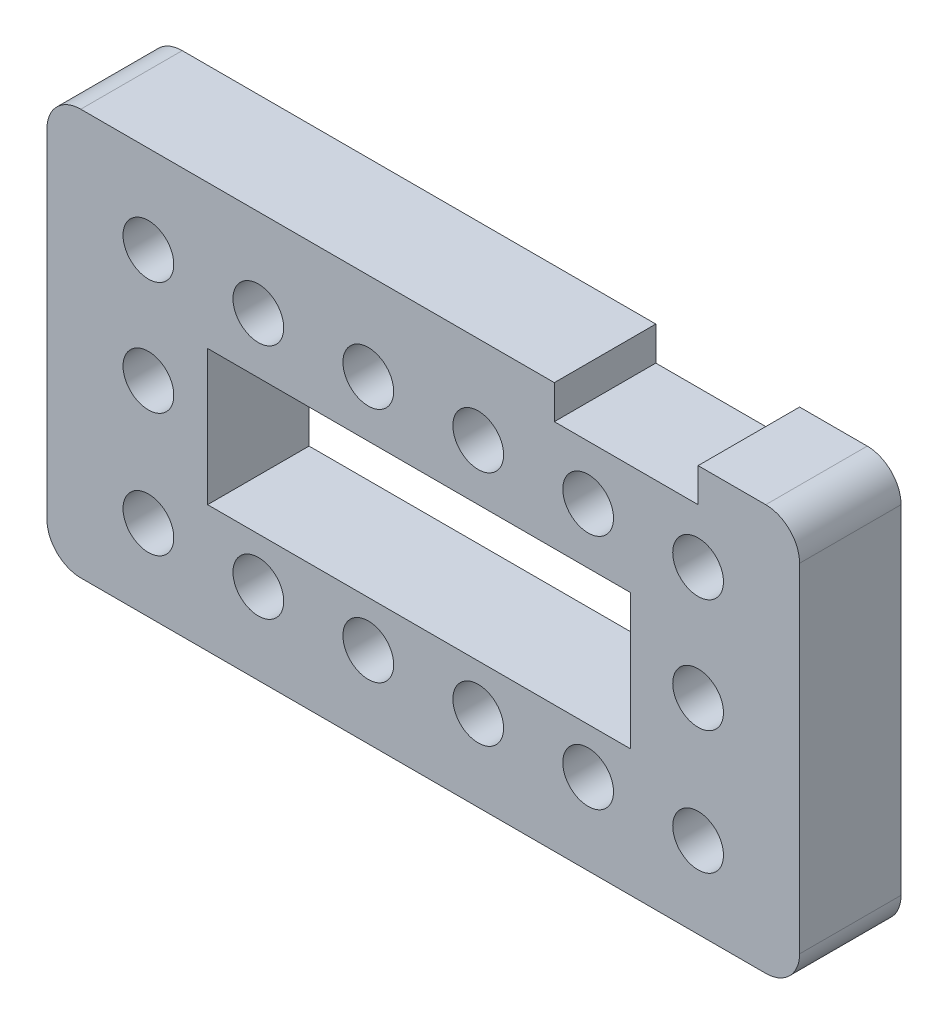
ISO-10303-21;
HEADER;
FILE_DESCRIPTION(('STEP AP214'),'2;1');
FILE_NAME('part.step','',(''),(''),'','','');
FILE_SCHEMA(('AUTOMOTIVE_DESIGN { 1 0 10303 214 1 1 1 1 }'));
ENDSEC;
DATA;
#1=APPLICATION_CONTEXT('core data for automotive mechanical design processes');
#2=APPLICATION_PROTOCOL_DEFINITION('international standard','automotive_design',2000,#1);
#3=PRODUCT_CONTEXT('',#1,'mechanical');
#4=PRODUCT('Part','Part','',(#3));
#5=PRODUCT_RELATED_PRODUCT_CATEGORY('part','',(#4));
#6=PRODUCT_DEFINITION_FORMATION('','',#4);
#7=PRODUCT_DEFINITION_CONTEXT('part definition',#1,'design');
#8=PRODUCT_DEFINITION('design','',#6,#7);
#9=PRODUCT_DEFINITION_SHAPE('','',#8);
#10=(LENGTH_UNIT() NAMED_UNIT(*) SI_UNIT(.MILLI.,.METRE.));
#11=(NAMED_UNIT(*) PLANE_ANGLE_UNIT() SI_UNIT($,.RADIAN.));
#12=(NAMED_UNIT(*) SI_UNIT($,.STERADIAN.) SOLID_ANGLE_UNIT());
#13=UNCERTAINTY_MEASURE_WITH_UNIT(LENGTH_MEASURE(1.E-05),#10,'distance_accuracy_value','');
#14=(GEOMETRIC_REPRESENTATION_CONTEXT(3) GLOBAL_UNCERTAINTY_ASSIGNED_CONTEXT((#13)) GLOBAL_UNIT_ASSIGNED_CONTEXT((#10,
#11,#12)) REPRESENTATION_CONTEXT('',''));
#15=CARTESIAN_POINT('',(0.,0.,0.));
#16=DIRECTION('',(0.,0.,1.));
#17=DIRECTION('',(1.,0.,0.));
#18=AXIS2_PLACEMENT_3D('',#15,#16,#17);
#19=CARTESIAN_POINT('',(-2.,22.,6.));
#20=DIRECTION('',(0.,1.,0.));
#21=DIRECTION('',(0.,0.,-1.));
#22=AXIS2_PLACEMENT_3D('',#19,#20,#21);
#23=PLANE('',#22);
#24=DIRECTION('',(1.,0.,0.));
#25=VECTOR('',#24,1.);
#26=CARTESIAN_POINT('',(-2.,22.,6.));
#27=LINE('',#26,#25);
#28=CARTESIAN_POINT('',(36.5,22.,6.));
#29=VERTEX_POINT('',#28);
#30=CARTESIAN_POINT('',(40.5,22.,6.));
#31=VERTEX_POINT('',#30);
#32=EDGE_CURVE('E159',#29,#31,#27,.T.);
#33=ORIENTED_EDGE('',*,*,#32,.F.);
#34=DIRECTION('',(0.,0.,1.));
#35=VECTOR('',#34,1.);
#36=CARTESIAN_POINT('',(36.5,22.,-26.5));
#37=LINE('',#36,#35);
#38=CARTESIAN_POINT('',(36.5,22.,12.));
#39=VERTEX_POINT('',#38);
#40=EDGE_CURVE('E151',#29,#39,#37,.T.);
#41=ORIENTED_EDGE('',*,*,#40,.T.);
#42=DIRECTION('',(1.,0.,0.));
#43=VECTOR('',#42,1.);
#44=CARTESIAN_POINT('',(-2.,22.,12.));
#45=LINE('',#44,#43);
#46=CARTESIAN_POINT('',(40.5,22.,12.));
#47=VERTEX_POINT('',#46);
#48=EDGE_CURVE('E184',#39,#47,#45,.T.);
#49=ORIENTED_EDGE('',*,*,#48,.T.);
#50=DIRECTION('',(0.,0.,1.));
#51=VECTOR('',#50,1.);
#52=CARTESIAN_POINT('',(40.5,22.,6.));
#53=LINE('',#52,#51);
#54=EDGE_CURVE('E217',#47,#31,#53,.F.);
#55=ORIENTED_EDGE('',*,*,#54,.T.);
#56=EDGE_LOOP('',(#33,#41,#49,#55));
#57=FACE_BOUND('',#56,.T.);
#58=ADVANCED_FACE('F17',(#57),#23,.T.);
#59=CARTESIAN_POINT('',(0.,0.,12.));
#60=DIRECTION('',(0.,0.,1.));
#61=DIRECTION('',(-1.,0.,0.));
#62=AXIS2_PLACEMENT_3D('',#59,#60,#61);
#63=PLANE('',#62);
#64=DIRECTION('',(0.,1.,0.));
#65=VECTOR('',#64,1.);
#66=CARTESIAN_POINT('',(36.5,0.,12.));
#67=LINE('',#66,#65);
#68=CARTESIAN_POINT('',(36.5,20.,12.));
#69=VERTEX_POINT('',#68);
#70=EDGE_CURVE('E280',#69,#39,#67,.T.);
#71=ORIENTED_EDGE('',*,*,#70,.F.);
#72=DIRECTION('',(1.,0.,0.));
#73=VECTOR('',#72,1.);
#74=CARTESIAN_POINT('',(0.,20.,12.));
#75=LINE('',#74,#73);
#76=CARTESIAN_POINT('',(28.,20.,12.));
#77=VERTEX_POINT('',#76);
#78=EDGE_CURVE('E271',#77,#69,#75,.T.);
#79=ORIENTED_EDGE('',*,*,#78,.F.);
#80=DIRECTION('',(0.,-1.,0.));
#81=VECTOR('',#80,1.);
#82=CARTESIAN_POINT('',(28.,0.,12.));
#83=LINE('',#82,#81);
#84=CARTESIAN_POINT('',(28.,22.,12.));
#85=VERTEX_POINT('',#84);
#86=EDGE_CURVE('E275',#85,#77,#83,.T.);
#87=ORIENTED_EDGE('',*,*,#86,.F.);
#88=CARTESIAN_POINT('',(0.,22.,12.));
#89=VERTEX_POINT('',#88);
#90=EDGE_CURVE('E149',#89,#85,#45,.T.);
#91=ORIENTED_EDGE('',*,*,#90,.F.);
#92=CARTESIAN_POINT('',(0.,20.,12.));
#93=DIRECTION('',(0.,0.,1.));
#94=DIRECTION('',(1.,0.,0.));
#95=AXIS2_PLACEMENT_3D('',#92,#93,#94);
#96=CIRCLE('',#95,2.);
#97=CARTESIAN_POINT('',(-2.,20.,12.));
#98=VERTEX_POINT('',#97);
#99=EDGE_CURVE('E201',#89,#98,#96,.T.);
#100=ORIENTED_EDGE('',*,*,#99,.T.);
#101=DIRECTION('',(0.,1.,0.));
#102=VECTOR('',#101,1.);
#103=CARTESIAN_POINT('',(-2.,-2.,12.));
#104=LINE('',#103,#102);
#105=CARTESIAN_POINT('',(-2.,0.,12.));
#106=VERTEX_POINT('',#105);
#107=EDGE_CURVE('E170',#106,#98,#104,.T.);
#108=ORIENTED_EDGE('',*,*,#107,.F.);
#109=CARTESIAN_POINT('',(0.,0.,12.));
#110=DIRECTION('',(0.,0.,1.));
#111=DIRECTION('',(1.,0.,0.));
#112=AXIS2_PLACEMENT_3D('',#109,#110,#111);
#113=CIRCLE('',#112,2.);
#114=CARTESIAN_POINT('',(0.,-2.,12.));
#115=VERTEX_POINT('',#114);
#116=EDGE_CURVE('E204',#106,#115,#113,.T.);
#117=ORIENTED_EDGE('',*,*,#116,.T.);
#118=DIRECTION('',(-1.,0.,0.));
#119=VECTOR('',#118,1.);
#120=CARTESIAN_POINT('',(42.5,-2.,12.));
#121=LINE('',#120,#119);
#122=CARTESIAN_POINT('',(40.5,-2.,12.));
#123=VERTEX_POINT('',#122);
#124=EDGE_CURVE('E188',#123,#115,#121,.T.);
#125=ORIENTED_EDGE('',*,*,#124,.F.);
#126=CARTESIAN_POINT('',(40.5,0.,12.));
#127=DIRECTION('',(0.,0.,1.));
#128=DIRECTION('',(1.,0.,0.));
#129=AXIS2_PLACEMENT_3D('',#126,#127,#128);
#130=CIRCLE('',#129,2.);
#131=CARTESIAN_POINT('',(42.5,0.,12.));
#132=VERTEX_POINT('',#131);
#133=EDGE_CURVE('E207',#123,#132,#130,.T.);
#134=ORIENTED_EDGE('',*,*,#133,.T.);
#135=DIRECTION('',(0.,-1.,0.));
#136=VECTOR('',#135,1.);
#137=CARTESIAN_POINT('',(42.5,22.,12.));
#138=LINE('',#137,#136);
#139=CARTESIAN_POINT('',(42.5,20.,12.));
#140=VERTEX_POINT('',#139);
#141=EDGE_CURVE('E183',#140,#132,#138,.T.);
#142=ORIENTED_EDGE('',*,*,#141,.F.);
#143=CARTESIAN_POINT('',(40.5,20.,12.));
#144=DIRECTION('',(0.,0.,1.));
#145=DIRECTION('',(1.,0.,0.));
#146=AXIS2_PLACEMENT_3D('',#143,#144,#145);
#147=CIRCLE('',#146,2.);
#148=EDGE_CURVE('E210',#140,#47,#147,.T.);
#149=ORIENTED_EDGE('',*,*,#148,.T.);
#150=ORIENTED_EDGE('',*,*,#48,.F.);
#151=EDGE_LOOP('',(#71,#79,#87,#91,#100,#108,#117,#125,#134,#142,#149,#150));
#152=FACE_BOUND('',#151,.T.);
#153=CARTESIAN_POINT('',(10.5,16.8007845059996,12.));
#154=DIRECTION('',(0.,0.,-1.));
#155=DIRECTION('',(-1.,0.,0.));
#156=AXIS2_PLACEMENT_3D('',#153,#154,#155);
#157=CIRCLE('',#156,1.5);
#158=CARTESIAN_POINT('',(9.,16.8007845059996,12.));
#159=VERTEX_POINT('',#158);
#160=EDGE_CURVE('E299',#159,#159,#157,.T.);
#161=ORIENTED_EDGE('',*,*,#160,.T.);
#162=EDGE_LOOP('',(#161));
#163=FACE_BOUND('',#162,.T.);
#164=CARTESIAN_POINT('',(36.5,16.8007845059996,12.));
#165=DIRECTION('',(0.,0.,-1.));
#166=DIRECTION('',(-1.,0.,0.));
#167=AXIS2_PLACEMENT_3D('',#164,#165,#166);
#168=CIRCLE('',#167,1.5);
#169=CARTESIAN_POINT('',(35.,16.8007845059996,12.));
#170=VERTEX_POINT('',#169);
#171=EDGE_CURVE('E315',#170,#170,#168,.T.);
#172=ORIENTED_EDGE('',*,*,#171,.T.);
#173=EDGE_LOOP('',(#172));
#174=FACE_BOUND('',#173,.T.);
#175=CARTESIAN_POINT('',(30.,2.80078450599959,12.));
#176=DIRECTION('',(0.,0.,-1.));
#177=DIRECTION('',(-1.,0.,0.));
#178=AXIS2_PLACEMENT_3D('',#175,#176,#177);
#179=CIRCLE('',#178,1.5);
#180=CARTESIAN_POINT('',(28.5,2.80078450599959,12.));
#181=VERTEX_POINT('',#180);
#182=EDGE_CURVE('E331',#181,#181,#179,.T.);
#183=ORIENTED_EDGE('',*,*,#182,.T.);
#184=EDGE_LOOP('',(#183));
#185=FACE_BOUND('',#184,.T.);
#186=CARTESIAN_POINT('',(4.,10.1007845059996,12.));
#187=DIRECTION('',(0.,0.,-1.));
#188=DIRECTION('',(-1.,0.,0.));
#189=AXIS2_PLACEMENT_3D('',#186,#187,#188);
#190=CIRCLE('',#189,1.5);
#191=CARTESIAN_POINT('',(2.5,10.1007845059996,12.));
#192=VERTEX_POINT('',#191);
#193=EDGE_CURVE('E347',#192,#192,#190,.T.);
#194=ORIENTED_EDGE('',*,*,#193,.T.);
#195=EDGE_LOOP('',(#194));
#196=FACE_BOUND('',#195,.T.);
#197=CARTESIAN_POINT('',(17.,16.8007845059996,12.));
#198=DIRECTION('',(0.,0.,-1.));
#199=DIRECTION('',(-1.,0.,0.));
#200=AXIS2_PLACEMENT_3D('',#197,#198,#199);
#201=CIRCLE('',#200,1.5);
#202=CARTESIAN_POINT('',(15.5,16.8007845059996,12.));
#203=VERTEX_POINT('',#202);
#204=EDGE_CURVE('E363',#203,#203,#201,.T.);
#205=ORIENTED_EDGE('',*,*,#204,.T.);
#206=EDGE_LOOP('',(#205));
#207=FACE_BOUND('',#206,.T.);
#208=CARTESIAN_POINT('',(36.5,2.80078450599959,12.));
#209=DIRECTION('',(0.,0.,-1.));
#210=DIRECTION('',(-1.,0.,0.));
#211=AXIS2_PLACEMENT_3D('',#208,#209,#210);
#212=CIRCLE('',#211,1.5);
#213=CARTESIAN_POINT('',(35.,2.80078450599959,12.));
#214=VERTEX_POINT('',#213);
#215=EDGE_CURVE('E379',#214,#214,#212,.T.);
#216=ORIENTED_EDGE('',*,*,#215,.T.);
#217=EDGE_LOOP('',(#216));
#218=FACE_BOUND('',#217,.T.);
#219=CARTESIAN_POINT('',(10.5,2.80078450599959,12.));
#220=DIRECTION('',(0.,0.,-1.));
#221=DIRECTION('',(-1.,0.,0.));
#222=AXIS2_PLACEMENT_3D('',#219,#220,#221);
#223=CIRCLE('',#222,1.5);
#224=CARTESIAN_POINT('',(9.,2.80078450599959,12.));
#225=VERTEX_POINT('',#224);
#226=EDGE_CURVE('E395',#225,#225,#223,.T.);
#227=ORIENTED_EDGE('',*,*,#226,.T.);
#228=EDGE_LOOP('',(#227));
#229=FACE_BOUND('',#228,.T.);
#230=DIRECTION('',(-1.,0.,0.));
#231=VECTOR('',#230,1.);
#232=CARTESIAN_POINT('',(32.5,5.5,12.));
#233=LINE('',#232,#231);
#234=CARTESIAN_POINT('',(32.5,5.5,12.));
#235=VERTEX_POINT('',#234);
#236=CARTESIAN_POINT('',(7.5,5.5,12.));
#237=VERTEX_POINT('',#236);
#238=EDGE_CURVE('E412',#235,#237,#233,.T.);
#239=ORIENTED_EDGE('',*,*,#238,.T.);
#240=DIRECTION('',(0.,1.,0.));
#241=VECTOR('',#240,1.);
#242=CARTESIAN_POINT('',(7.5,5.5,12.));
#243=LINE('',#242,#241);
#244=CARTESIAN_POINT('',(7.5,13.5,12.));
#245=VERTEX_POINT('',#244);
#246=EDGE_CURVE('E399',#237,#245,#243,.T.);
#247=ORIENTED_EDGE('',*,*,#246,.T.);
#248=DIRECTION('',(1.,0.,0.));
#249=VECTOR('',#248,1.);
#250=CARTESIAN_POINT('',(7.5,13.5,12.));
#251=LINE('',#250,#249);
#252=CARTESIAN_POINT('',(32.5,13.5,12.));
#253=VERTEX_POINT('',#252);
#254=EDGE_CURVE('E406',#245,#253,#251,.T.);
#255=ORIENTED_EDGE('',*,*,#254,.T.);
#256=DIRECTION('',(0.,-1.,0.));
#257=VECTOR('',#256,1.);
#258=CARTESIAN_POINT('',(32.5,13.5,12.));
#259=LINE('',#258,#257);
#260=EDGE_CURVE('E41',#253,#235,#259,.T.);
#261=ORIENTED_EDGE('',*,*,#260,.T.);
#262=EDGE_LOOP('',(#239,#247,#255,#261));
#263=FACE_BOUND('',#262,.T.);
#264=CARTESIAN_POINT('',(23.5,2.80078450599959,12.));
#265=DIRECTION('',(0.,0.,-1.));
#266=DIRECTION('',(-1.,0.,0.));
#267=AXIS2_PLACEMENT_3D('',#264,#265,#266);
#268=CIRCLE('',#267,1.5);
#269=CARTESIAN_POINT('',(22.,2.80078450599959,12.));
#270=VERTEX_POINT('',#269);
#271=EDGE_CURVE('E387',#270,#270,#268,.T.);
#272=ORIENTED_EDGE('',*,*,#271,.T.);
#273=EDGE_LOOP('',(#272));
#274=FACE_BOUND('',#273,.T.);
#275=CARTESIAN_POINT('',(30.,16.8007845059996,12.));
#276=DIRECTION('',(0.,0.,-1.));
#277=DIRECTION('',(-1.,0.,0.));
#278=AXIS2_PLACEMENT_3D('',#275,#276,#277);
#279=CIRCLE('',#278,1.5);
#280=CARTESIAN_POINT('',(28.5,16.8007845059996,12.));
#281=VERTEX_POINT('',#280);
#282=EDGE_CURVE('E371',#281,#281,#279,.T.);
#283=ORIENTED_EDGE('',*,*,#282,.T.);
#284=EDGE_LOOP('',(#283));
#285=FACE_BOUND('',#284,.T.);
#286=CARTESIAN_POINT('',(4.,16.8007845059996,12.));
#287=DIRECTION('',(0.,0.,-1.));
#288=DIRECTION('',(-1.,0.,0.));
#289=AXIS2_PLACEMENT_3D('',#286,#287,#288);
#290=CIRCLE('',#289,1.5);
#291=CARTESIAN_POINT('',(2.5,16.8007845059996,12.));
#292=VERTEX_POINT('',#291);
#293=EDGE_CURVE('E355',#292,#292,#290,.T.);
#294=ORIENTED_EDGE('',*,*,#293,.T.);
#295=EDGE_LOOP('',(#294));
#296=FACE_BOUND('',#295,.T.);
#297=CARTESIAN_POINT('',(17.,2.80078450599959,12.));
#298=DIRECTION('',(0.,0.,-1.));
#299=DIRECTION('',(-1.,0.,0.));
#300=AXIS2_PLACEMENT_3D('',#297,#298,#299);
#301=CIRCLE('',#300,1.5);
#302=CARTESIAN_POINT('',(15.5,2.80078450599959,12.));
#303=VERTEX_POINT('',#302);
#304=EDGE_CURVE('E339',#303,#303,#301,.T.);
#305=ORIENTED_EDGE('',*,*,#304,.T.);
#306=EDGE_LOOP('',(#305));
#307=FACE_BOUND('',#306,.T.);
#308=CARTESIAN_POINT('',(36.5,10.1007845059996,12.));
#309=DIRECTION('',(0.,0.,-1.));
#310=DIRECTION('',(-1.,0.,0.));
#311=AXIS2_PLACEMENT_3D('',#308,#309,#310);
#312=CIRCLE('',#311,1.5);
#313=CARTESIAN_POINT('',(35.,10.1007845059996,12.));
#314=VERTEX_POINT('',#313);
#315=EDGE_CURVE('E323',#314,#314,#312,.T.);
#316=ORIENTED_EDGE('',*,*,#315,.T.);
#317=EDGE_LOOP('',(#316));
#318=FACE_BOUND('',#317,.T.);
#319=CARTESIAN_POINT('',(23.5,16.8007845059996,12.));
#320=DIRECTION('',(0.,0.,-1.));
#321=DIRECTION('',(-1.,0.,0.));
#322=AXIS2_PLACEMENT_3D('',#319,#320,#321);
#323=CIRCLE('',#322,1.5);
#324=CARTESIAN_POINT('',(22.,16.8007845059996,12.));
#325=VERTEX_POINT('',#324);
#326=EDGE_CURVE('E307',#325,#325,#323,.T.);
#327=ORIENTED_EDGE('',*,*,#326,.T.);
#328=EDGE_LOOP('',(#327));
#329=FACE_BOUND('',#328,.T.);
#330=CARTESIAN_POINT('',(4.,2.80078450599959,12.));
#331=DIRECTION('',(0.,0.,-1.));
#332=DIRECTION('',(-1.,0.,0.));
#333=AXIS2_PLACEMENT_3D('',#330,#331,#332);
#334=CIRCLE('',#333,1.5);
#335=CARTESIAN_POINT('',(2.5,2.80078450599959,12.));
#336=VERTEX_POINT('',#335);
#337=EDGE_CURVE('E291',#336,#336,#334,.T.);
#338=ORIENTED_EDGE('',*,*,#337,.T.);
#339=EDGE_LOOP('',(#338));
#340=FACE_BOUND('',#339,.T.);
#341=ADVANCED_FACE('F433',(#152,#163,#174,#185,#196,#207,#218,#229,#263,#274,#285,#296,#307,
#318,#329,#340),#63,.T.);
#342=DIRECTION('',(0.,0.,1.));
#343=VECTOR('',#342,1.);
#344=CARTESIAN_POINT('',(28.,22.,-26.5));
#345=LINE('',#344,#343);
#346=CARTESIAN_POINT('',(28.,22.,6.));
#347=VERTEX_POINT('',#346);
#348=EDGE_CURVE('E133',#347,#85,#345,.T.);
#349=ORIENTED_EDGE('',*,*,#348,.F.);
#350=CARTESIAN_POINT('',(0.,22.,6.));
#351=VERTEX_POINT('',#350);
#352=EDGE_CURVE('E146',#351,#347,#27,.T.);
#353=ORIENTED_EDGE('',*,*,#352,.F.);
#354=DIRECTION('',(0.,0.,1.));
#355=VECTOR('',#354,1.);
#356=CARTESIAN_POINT('',(0.,22.,6.));
#357=LINE('',#356,#355);
#358=EDGE_CURVE('E214',#351,#89,#357,.T.);
#359=ORIENTED_EDGE('',*,*,#358,.T.);
#360=ORIENTED_EDGE('',*,*,#90,.T.);
#361=EDGE_LOOP('',(#349,#353,#359,#360));
#362=FACE_BOUND('',#361,.T.);
#363=ADVANCED_FACE('F144',(#362),#23,.T.);
#364=CARTESIAN_POINT('',(42.5,22.,6.));
#365=DIRECTION('',(1.,0.,0.));
#366=DIRECTION('',(0.,0.,1.));
#367=AXIS2_PLACEMENT_3D('',#364,#365,#366);
#368=PLANE('',#367);
#369=DIRECTION('',(0.,-1.,0.));
#370=VECTOR('',#369,1.);
#371=CARTESIAN_POINT('',(42.5,22.,6.));
#372=LINE('',#371,#370);
#373=CARTESIAN_POINT('',(42.5,20.,6.));
#374=VERTEX_POINT('',#373);
#375=CARTESIAN_POINT('',(42.5,0.,6.));
#376=VERTEX_POINT('',#375);
#377=EDGE_CURVE('E158',#374,#376,#372,.T.);
#378=ORIENTED_EDGE('',*,*,#377,.F.);
#379=DIRECTION('',(0.,0.,1.));
#380=VECTOR('',#379,1.);
#381=CARTESIAN_POINT('',(42.5,20.,6.));
#382=LINE('',#381,#380);
#383=EDGE_CURVE('E197',#374,#140,#382,.T.);
#384=ORIENTED_EDGE('',*,*,#383,.T.);
#385=ORIENTED_EDGE('',*,*,#141,.T.);
#386=DIRECTION('',(0.,0.,1.));
#387=VECTOR('',#386,1.);
#388=CARTESIAN_POINT('',(42.5,0.,6.));
#389=LINE('',#388,#387);
#390=EDGE_CURVE('E181',#132,#376,#389,.F.);
#391=ORIENTED_EDGE('',*,*,#390,.T.);
#392=EDGE_LOOP('',(#378,#384,#385,#391));
#393=FACE_BOUND('',#392,.T.);
#394=ADVANCED_FACE('F441',(#393),#368,.T.);
#395=CARTESIAN_POINT('',(42.5,-2.,6.));
#396=DIRECTION('',(0.,-1.,0.));
#397=DIRECTION('',(0.,0.,1.));
#398=AXIS2_PLACEMENT_3D('',#395,#396,#397);
#399=PLANE('',#398);
#400=DIRECTION('',(-1.,0.,0.));
#401=VECTOR('',#400,1.);
#402=CARTESIAN_POINT('',(42.5,-2.,6.));
#403=LINE('',#402,#401);
#404=CARTESIAN_POINT('',(40.5,-2.,6.));
#405=VERTEX_POINT('',#404);
#406=CARTESIAN_POINT('',(0.,-2.,6.));
#407=VERTEX_POINT('',#406);
#408=EDGE_CURVE('E167',#405,#407,#403,.T.);
#409=ORIENTED_EDGE('',*,*,#408,.F.);
#410=DIRECTION('',(0.,0.,1.));
#411=VECTOR('',#410,1.);
#412=CARTESIAN_POINT('',(40.5,-2.,6.));
#413=LINE('',#412,#411);
#414=EDGE_CURVE('E235',#405,#123,#413,.T.);
#415=ORIENTED_EDGE('',*,*,#414,.T.);
#416=ORIENTED_EDGE('',*,*,#124,.T.);
#417=DIRECTION('',(0.,0.,1.));
#418=VECTOR('',#417,1.);
#419=CARTESIAN_POINT('',(0.,-2.,6.));
#420=LINE('',#419,#418);
#421=EDGE_CURVE('E232',#115,#407,#420,.F.);
#422=ORIENTED_EDGE('',*,*,#421,.T.);
#423=EDGE_LOOP('',(#409,#415,#416,#422));
#424=FACE_BOUND('',#423,.T.);
#425=ADVANCED_FACE('F449',(#424),#399,.T.);
#426=CARTESIAN_POINT('',(-2.,-2.,6.));
#427=DIRECTION('',(-1.,0.,0.));
#428=DIRECTION('',(0.,0.,-1.));
#429=AXIS2_PLACEMENT_3D('',#426,#427,#428);
#430=PLANE('',#429);
#431=DIRECTION('',(0.,1.,0.));
#432=VECTOR('',#431,1.);
#433=CARTESIAN_POINT('',(-2.,-2.,6.));
#434=LINE('',#433,#432);
#435=CARTESIAN_POINT('',(-2.,0.,6.));
#436=VERTEX_POINT('',#435);
#437=CARTESIAN_POINT('',(-2.,20.,6.));
#438=VERTEX_POINT('',#437);
#439=EDGE_CURVE('E178',#436,#438,#434,.T.);
#440=ORIENTED_EDGE('',*,*,#439,.F.);
#441=DIRECTION('',(0.,0.,1.));
#442=VECTOR('',#441,1.);
#443=CARTESIAN_POINT('',(-2.,0.,6.));
#444=LINE('',#443,#442);
#445=EDGE_CURVE('E242',#436,#106,#444,.T.);
#446=ORIENTED_EDGE('',*,*,#445,.T.);
#447=ORIENTED_EDGE('',*,*,#107,.T.);
#448=DIRECTION('',(0.,0.,1.));
#449=VECTOR('',#448,1.);
#450=CARTESIAN_POINT('',(-2.,20.,6.));
#451=LINE('',#450,#449);
#452=EDGE_CURVE('E239',#98,#438,#451,.F.);
#453=ORIENTED_EDGE('',*,*,#452,.T.);
#454=EDGE_LOOP('',(#440,#446,#447,#453));
#455=FACE_BOUND('',#454,.T.);
#456=ADVANCED_FACE('F457',(#455),#430,.T.);
#457=CARTESIAN_POINT('',(0.,0.,6.));
#458=DIRECTION('',(0.,0.,1.));
#459=DIRECTION('',(-1.,0.,0.));
#460=AXIS2_PLACEMENT_3D('',#457,#458,#459);
#461=PLANE('',#460);
#462=CARTESIAN_POINT('',(4.,2.80078450599959,6.));
#463=DIRECTION('',(0.,0.,-1.));
#464=DIRECTION('',(-1.,0.,0.));
#465=AXIS2_PLACEMENT_3D('',#462,#463,#464);
#466=CIRCLE('',#465,1.5);
#467=CARTESIAN_POINT('',(2.5,2.80078450599959,6.));
#468=VERTEX_POINT('',#467);
#469=EDGE_CURVE('E290',#468,#468,#466,.F.);
#470=ORIENTED_EDGE('',*,*,#469,.T.);
#471=EDGE_LOOP('',(#470));
#472=FACE_BOUND('',#471,.T.);
#473=CARTESIAN_POINT('',(10.5,16.8007845059996,6.));
#474=DIRECTION('',(0.,0.,-1.));
#475=DIRECTION('',(-1.,0.,0.));
#476=AXIS2_PLACEMENT_3D('',#473,#474,#475);
#477=CIRCLE('',#476,1.5);
#478=CARTESIAN_POINT('',(9.,16.8007845059996,6.));
#479=VERTEX_POINT('',#478);
#480=EDGE_CURVE('E295',#479,#479,#477,.F.);
#481=ORIENTED_EDGE('',*,*,#480,.T.);
#482=EDGE_LOOP('',(#481));
#483=FACE_BOUND('',#482,.T.);
#484=CARTESIAN_POINT('',(23.5,16.8007845059996,6.));
#485=DIRECTION('',(0.,0.,-1.));
#486=DIRECTION('',(-1.,0.,0.));
#487=AXIS2_PLACEMENT_3D('',#484,#485,#486);
#488=CIRCLE('',#487,1.5);
#489=CARTESIAN_POINT('',(22.,16.8007845059996,6.));
#490=VERTEX_POINT('',#489);
#491=EDGE_CURVE('E303',#490,#490,#488,.F.);
#492=ORIENTED_EDGE('',*,*,#491,.T.);
#493=EDGE_LOOP('',(#492));
#494=FACE_BOUND('',#493,.T.);
#495=CARTESIAN_POINT('',(36.5,16.8007845059996,6.));
#496=DIRECTION('',(0.,0.,-1.));
#497=DIRECTION('',(-1.,0.,0.));
#498=AXIS2_PLACEMENT_3D('',#495,#496,#497);
#499=CIRCLE('',#498,1.5);
#500=CARTESIAN_POINT('',(35.,16.8007845059996,6.));
#501=VERTEX_POINT('',#500);
#502=EDGE_CURVE('E311',#501,#501,#499,.F.);
#503=ORIENTED_EDGE('',*,*,#502,.T.);
#504=EDGE_LOOP('',(#503));
#505=FACE_BOUND('',#504,.T.);
#506=CARTESIAN_POINT('',(36.5,10.1007845059996,6.));
#507=DIRECTION('',(0.,0.,-1.));
#508=DIRECTION('',(-1.,0.,0.));
#509=AXIS2_PLACEMENT_3D('',#506,#507,#508);
#510=CIRCLE('',#509,1.5);
#511=CARTESIAN_POINT('',(35.,10.1007845059996,6.));
#512=VERTEX_POINT('',#511);
#513=EDGE_CURVE('E319',#512,#512,#510,.F.);
#514=ORIENTED_EDGE('',*,*,#513,.T.);
#515=EDGE_LOOP('',(#514));
#516=FACE_BOUND('',#515,.T.);
#517=CARTESIAN_POINT('',(30.,2.80078450599959,6.));
#518=DIRECTION('',(0.,0.,-1.));
#519=DIRECTION('',(-1.,0.,0.));
#520=AXIS2_PLACEMENT_3D('',#517,#518,#519);
#521=CIRCLE('',#520,1.5);
#522=CARTESIAN_POINT('',(28.5,2.80078450599959,6.));
#523=VERTEX_POINT('',#522);
#524=EDGE_CURVE('E327',#523,#523,#521,.F.);
#525=ORIENTED_EDGE('',*,*,#524,.T.);
#526=EDGE_LOOP('',(#525));
#527=FACE_BOUND('',#526,.T.);
#528=CARTESIAN_POINT('',(17.,2.80078450599959,6.));
#529=DIRECTION('',(0.,0.,-1.));
#530=DIRECTION('',(-1.,0.,0.));
#531=AXIS2_PLACEMENT_3D('',#528,#529,#530);
#532=CIRCLE('',#531,1.5);
#533=CARTESIAN_POINT('',(15.5,2.80078450599959,6.));
#534=VERTEX_POINT('',#533);
#535=EDGE_CURVE('E335',#534,#534,#532,.F.);
#536=ORIENTED_EDGE('',*,*,#535,.T.);
#537=EDGE_LOOP('',(#536));
#538=FACE_BOUND('',#537,.T.);
#539=CARTESIAN_POINT('',(4.,10.1007845059996,6.));
#540=DIRECTION('',(0.,0.,-1.));
#541=DIRECTION('',(-1.,0.,0.));
#542=AXIS2_PLACEMENT_3D('',#539,#540,#541);
#543=CIRCLE('',#542,1.5);
#544=CARTESIAN_POINT('',(2.5,10.1007845059996,6.));
#545=VERTEX_POINT('',#544);
#546=EDGE_CURVE('E343',#545,#545,#543,.F.);
#547=ORIENTED_EDGE('',*,*,#546,.T.);
#548=EDGE_LOOP('',(#547));
#549=FACE_BOUND('',#548,.T.);
#550=CARTESIAN_POINT('',(4.,16.8007845059996,6.));
#551=DIRECTION('',(0.,0.,-1.));
#552=DIRECTION('',(-1.,0.,0.));
#553=AXIS2_PLACEMENT_3D('',#550,#551,#552);
#554=CIRCLE('',#553,1.5);
#555=CARTESIAN_POINT('',(2.5,16.8007845059996,6.));
#556=VERTEX_POINT('',#555);
#557=EDGE_CURVE('E351',#556,#556,#554,.F.);
#558=ORIENTED_EDGE('',*,*,#557,.T.);
#559=EDGE_LOOP('',(#558));
#560=FACE_BOUND('',#559,.T.);
#561=CARTESIAN_POINT('',(17.,16.8007845059996,6.));
#562=DIRECTION('',(0.,0.,-1.));
#563=DIRECTION('',(-1.,0.,0.));
#564=AXIS2_PLACEMENT_3D('',#561,#562,#563);
#565=CIRCLE('',#564,1.5);
#566=CARTESIAN_POINT('',(15.5,16.8007845059996,6.));
#567=VERTEX_POINT('',#566);
#568=EDGE_CURVE('E359',#567,#567,#565,.F.);
#569=ORIENTED_EDGE('',*,*,#568,.T.);
#570=EDGE_LOOP('',(#569));
#571=FACE_BOUND('',#570,.T.);
#572=CARTESIAN_POINT('',(30.,16.8007845059996,6.));
#573=DIRECTION('',(0.,0.,-1.));
#574=DIRECTION('',(-1.,0.,0.));
#575=AXIS2_PLACEMENT_3D('',#572,#573,#574);
#576=CIRCLE('',#575,1.5);
#577=CARTESIAN_POINT('',(28.5,16.8007845059996,6.));
#578=VERTEX_POINT('',#577);
#579=EDGE_CURVE('E367',#578,#578,#576,.F.);
#580=ORIENTED_EDGE('',*,*,#579,.T.);
#581=EDGE_LOOP('',(#580));
#582=FACE_BOUND('',#581,.T.);
#583=CARTESIAN_POINT('',(36.5,2.80078450599959,6.));
#584=DIRECTION('',(0.,0.,-1.));
#585=DIRECTION('',(-1.,0.,0.));
#586=AXIS2_PLACEMENT_3D('',#583,#584,#585);
#587=CIRCLE('',#586,1.5);
#588=CARTESIAN_POINT('',(35.,2.80078450599959,6.));
#589=VERTEX_POINT('',#588);
#590=EDGE_CURVE('E375',#589,#589,#587,.F.);
#591=ORIENTED_EDGE('',*,*,#590,.T.);
#592=EDGE_LOOP('',(#591));
#593=FACE_BOUND('',#592,.T.);
#594=CARTESIAN_POINT('',(23.5,2.80078450599959,6.));
#595=DIRECTION('',(0.,0.,-1.));
#596=DIRECTION('',(-1.,0.,0.));
#597=AXIS2_PLACEMENT_3D('',#594,#595,#596);
#598=CIRCLE('',#597,1.5);
#599=CARTESIAN_POINT('',(22.,2.80078450599959,6.));
#600=VERTEX_POINT('',#599);
#601=EDGE_CURVE('E383',#600,#600,#598,.F.);
#602=ORIENTED_EDGE('',*,*,#601,.T.);
#603=EDGE_LOOP('',(#602));
#604=FACE_BOUND('',#603,.T.);
#605=CARTESIAN_POINT('',(10.5,2.80078450599959,6.));
#606=DIRECTION('',(0.,0.,-1.));
#607=DIRECTION('',(-1.,0.,0.));
#608=AXIS2_PLACEMENT_3D('',#605,#606,#607);
#609=CIRCLE('',#608,1.5);
#610=CARTESIAN_POINT('',(9.,2.80078450599959,6.));
#611=VERTEX_POINT('',#610);
#612=EDGE_CURVE('E391',#611,#611,#609,.F.);
#613=ORIENTED_EDGE('',*,*,#612,.T.);
#614=EDGE_LOOP('',(#613));
#615=FACE_BOUND('',#614,.T.);
#616=DIRECTION('',(-1.,0.,0.));
#617=VECTOR('',#616,1.);
#618=CARTESIAN_POINT('',(0.,13.5,6.));
#619=LINE('',#618,#617);
#620=CARTESIAN_POINT('',(32.5,13.5,6.));
#621=VERTEX_POINT('',#620);
#622=CARTESIAN_POINT('',(7.5,13.5,6.));
#623=VERTEX_POINT('',#622);
#624=EDGE_CURVE('E254',#621,#623,#619,.T.);
#625=ORIENTED_EDGE('',*,*,#624,.T.);
#626=DIRECTION('',(0.,-1.,0.));
#627=VECTOR('',#626,1.);
#628=CARTESIAN_POINT('',(7.5,0.,6.));
#629=LINE('',#628,#627);
#630=CARTESIAN_POINT('',(7.5,5.5,6.));
#631=VERTEX_POINT('',#630);
#632=EDGE_CURVE('E139',#623,#631,#629,.T.);
#633=ORIENTED_EDGE('',*,*,#632,.T.);
#634=DIRECTION('',(1.,0.,0.));
#635=VECTOR('',#634,1.);
#636=CARTESIAN_POINT('',(0.,5.5,6.));
#637=LINE('',#636,#635);
#638=CARTESIAN_POINT('',(32.5,5.5,6.));
#639=VERTEX_POINT('',#638);
#640=EDGE_CURVE('E246',#631,#639,#637,.T.);
#641=ORIENTED_EDGE('',*,*,#640,.T.);
#642=DIRECTION('',(0.,1.,0.));
#643=VECTOR('',#642,1.);
#644=CARTESIAN_POINT('',(32.5,0.,6.));
#645=LINE('',#644,#643);
#646=EDGE_CURVE('E250',#639,#621,#645,.T.);
#647=ORIENTED_EDGE('',*,*,#646,.T.);
#648=EDGE_LOOP('',(#625,#633,#641,#647));
#649=FACE_BOUND('',#648,.T.);
#650=DIRECTION('',(1.,0.,0.));
#651=VECTOR('',#650,1.);
#652=CARTESIAN_POINT('',(0.,20.,6.));
#653=LINE('',#652,#651);
#654=CARTESIAN_POINT('',(28.,20.,6.));
#655=VERTEX_POINT('',#654);
#656=CARTESIAN_POINT('',(36.5,20.,6.));
#657=VERTEX_POINT('',#656);
#658=EDGE_CURVE('E26',#655,#657,#653,.T.);
#659=ORIENTED_EDGE('',*,*,#658,.T.);
#660=DIRECTION('',(0.,1.,0.));
#661=VECTOR('',#660,1.);
#662=CARTESIAN_POINT('',(36.5,0.,6.));
#663=LINE('',#662,#661);
#664=EDGE_CURVE('E11',#657,#29,#663,.T.);
#665=ORIENTED_EDGE('',*,*,#664,.T.);
#666=ORIENTED_EDGE('',*,*,#32,.T.);
#667=CARTESIAN_POINT('',(40.5,20.,6.));
#668=DIRECTION('',(0.,0.,1.));
#669=DIRECTION('',(1.,0.,0.));
#670=AXIS2_PLACEMENT_3D('',#667,#668,#669);
#671=CIRCLE('',#670,2.);
#672=EDGE_CURVE('E229',#31,#374,#671,.F.);
#673=ORIENTED_EDGE('',*,*,#672,.T.);
#674=ORIENTED_EDGE('',*,*,#377,.T.);
#675=CARTESIAN_POINT('',(40.5,0.,6.));
#676=DIRECTION('',(0.,0.,1.));
#677=DIRECTION('',(1.,0.,0.));
#678=AXIS2_PLACEMENT_3D('',#675,#676,#677);
#679=CIRCLE('',#678,2.);
#680=EDGE_CURVE('E226',#376,#405,#679,.F.);
#681=ORIENTED_EDGE('',*,*,#680,.T.);
#682=ORIENTED_EDGE('',*,*,#408,.T.);
#683=CARTESIAN_POINT('',(0.,0.,6.));
#684=DIRECTION('',(0.,0.,1.));
#685=DIRECTION('',(1.,0.,0.));
#686=AXIS2_PLACEMENT_3D('',#683,#684,#685);
#687=CIRCLE('',#686,2.);
#688=EDGE_CURVE('E223',#407,#436,#687,.F.);
#689=ORIENTED_EDGE('',*,*,#688,.T.);
#690=ORIENTED_EDGE('',*,*,#439,.T.);
#691=CARTESIAN_POINT('',(0.,20.,6.));
#692=DIRECTION('',(0.,0.,1.));
#693=DIRECTION('',(1.,0.,0.));
#694=AXIS2_PLACEMENT_3D('',#691,#692,#693);
#695=CIRCLE('',#694,2.);
#696=EDGE_CURVE('E156',#438,#351,#695,.F.);
#697=ORIENTED_EDGE('',*,*,#696,.T.);
#698=ORIENTED_EDGE('',*,*,#352,.T.);
#699=DIRECTION('',(0.,-1.,0.));
#700=VECTOR('',#699,1.);
#701=CARTESIAN_POINT('',(28.,0.,6.));
#702=LINE('',#701,#700);
#703=EDGE_CURVE('E130',#347,#655,#702,.T.);
#704=ORIENTED_EDGE('',*,*,#703,.T.);
#705=EDGE_LOOP('',(#659,#665,#666,#673,#674,#681,#682,#689,#690,#697,#698,#704));
#706=FACE_BOUND('',#705,.T.);
#707=ADVANCED_FACE('F153',(#472,#483,#494,#505,#516,#527,#538,#549,#560,#571,#582,#593,#604,
#615,#649,#706),#461,.F.);
#708=CARTESIAN_POINT('',(40.5,20.,6.));
#709=DIRECTION('',(0.,0.,1.));
#710=DIRECTION('',(1.,0.,0.));
#711=AXIS2_PLACEMENT_3D('',#708,#709,#710);
#712=CYLINDRICAL_SURFACE('',#711,2.);
#713=ORIENTED_EDGE('',*,*,#672,.F.);
#714=ORIENTED_EDGE('',*,*,#54,.F.);
#715=ORIENTED_EDGE('',*,*,#148,.F.);
#716=ORIENTED_EDGE('',*,*,#383,.F.);
#717=EDGE_LOOP('',(#713,#714,#715,#716));
#718=FACE_BOUND('',#717,.T.);
#719=ADVANCED_FACE('F437',(#718),#712,.T.);
#720=CARTESIAN_POINT('',(40.5,0.,6.));
#721=DIRECTION('',(0.,0.,1.));
#722=DIRECTION('',(1.,0.,0.));
#723=AXIS2_PLACEMENT_3D('',#720,#721,#722);
#724=CYLINDRICAL_SURFACE('',#723,2.);
#725=ORIENTED_EDGE('',*,*,#680,.F.);
#726=ORIENTED_EDGE('',*,*,#390,.F.);
#727=ORIENTED_EDGE('',*,*,#133,.F.);
#728=ORIENTED_EDGE('',*,*,#414,.F.);
#729=EDGE_LOOP('',(#725,#726,#727,#728));
#730=FACE_BOUND('',#729,.T.);
#731=ADVANCED_FACE('F444',(#730),#724,.T.);
#732=CARTESIAN_POINT('',(0.,0.,6.));
#733=DIRECTION('',(0.,0.,1.));
#734=DIRECTION('',(1.,0.,0.));
#735=AXIS2_PLACEMENT_3D('',#732,#733,#734);
#736=CYLINDRICAL_SURFACE('',#735,2.);
#737=ORIENTED_EDGE('',*,*,#688,.F.);
#738=ORIENTED_EDGE('',*,*,#421,.F.);
#739=ORIENTED_EDGE('',*,*,#116,.F.);
#740=ORIENTED_EDGE('',*,*,#445,.F.);
#741=EDGE_LOOP('',(#737,#738,#739,#740));
#742=FACE_BOUND('',#741,.T.);
#743=ADVANCED_FACE('F453',(#742),#736,.T.);
#744=CARTESIAN_POINT('',(0.,20.,6.));
#745=DIRECTION('',(0.,0.,1.));
#746=DIRECTION('',(1.,0.,0.));
#747=AXIS2_PLACEMENT_3D('',#744,#745,#746);
#748=CYLINDRICAL_SURFACE('',#747,2.);
#749=ORIENTED_EDGE('',*,*,#696,.F.);
#750=ORIENTED_EDGE('',*,*,#452,.F.);
#751=ORIENTED_EDGE('',*,*,#99,.F.);
#752=ORIENTED_EDGE('',*,*,#358,.F.);
#753=EDGE_LOOP('',(#749,#750,#751,#752));
#754=FACE_BOUND('',#753,.T.);
#755=ADVANCED_FACE('F19',(#754),#748,.T.);
#756=CARTESIAN_POINT('',(7.5,5.5,-13.));
#757=DIRECTION('',(-1.,0.,0.));
#758=DIRECTION('',(0.,0.,-1.));
#759=AXIS2_PLACEMENT_3D('',#756,#757,#758);
#760=PLANE('',#759);
#761=DIRECTION('',(0.,0.,1.));
#762=VECTOR('',#761,1.);
#763=CARTESIAN_POINT('',(7.5,13.5,-13.));
#764=LINE('',#763,#762);
#765=EDGE_CURVE('E421',#245,#623,#764,.F.);
#766=ORIENTED_EDGE('',*,*,#765,.F.);
#767=ORIENTED_EDGE('',*,*,#246,.F.);
#768=DIRECTION('',(0.,0.,1.));
#769=VECTOR('',#768,1.);
#770=CARTESIAN_POINT('',(7.5,5.5,-13.));
#771=LINE('',#770,#769);
#772=EDGE_CURVE('E172',#237,#631,#771,.F.);
#773=ORIENTED_EDGE('',*,*,#772,.T.);
#774=ORIENTED_EDGE('',*,*,#632,.F.);
#775=EDGE_LOOP('',(#766,#767,#773,#774));
#776=FACE_BOUND('',#775,.T.);
#777=ADVANCED_FACE('F494',(#776),#760,.F.);
#778=CARTESIAN_POINT('',(7.5,13.5,-13.));
#779=DIRECTION('',(0.,1.,0.));
#780=DIRECTION('',(0.,0.,-1.));
#781=AXIS2_PLACEMENT_3D('',#778,#779,#780);
#782=PLANE('',#781);
#783=DIRECTION('',(0.,0.,1.));
#784=VECTOR('',#783,1.);
#785=CARTESIAN_POINT('',(32.5,13.5,-13.));
#786=LINE('',#785,#784);
#787=EDGE_CURVE('E419',#253,#621,#786,.F.);
#788=ORIENTED_EDGE('',*,*,#787,.F.);
#789=ORIENTED_EDGE('',*,*,#254,.F.);
#790=ORIENTED_EDGE('',*,*,#765,.T.);
#791=ORIENTED_EDGE('',*,*,#624,.F.);
#792=EDGE_LOOP('',(#788,#789,#790,#791));
#793=FACE_BOUND('',#792,.T.);
#794=ADVANCED_FACE('F497',(#793),#782,.F.);
#795=CARTESIAN_POINT('',(32.5,13.5,-13.));
#796=DIRECTION('',(1.,0.,0.));
#797=DIRECTION('',(0.,0.,1.));
#798=AXIS2_PLACEMENT_3D('',#795,#796,#797);
#799=PLANE('',#798);
#800=DIRECTION('',(0.,0.,1.));
#801=VECTOR('',#800,1.);
#802=CARTESIAN_POINT('',(32.5,5.5,-13.));
#803=LINE('',#802,#801);
#804=EDGE_CURVE('E416',#235,#639,#803,.F.);
#805=ORIENTED_EDGE('',*,*,#804,.F.);
#806=ORIENTED_EDGE('',*,*,#260,.F.);
#807=ORIENTED_EDGE('',*,*,#787,.T.);
#808=ORIENTED_EDGE('',*,*,#646,.F.);
#809=EDGE_LOOP('',(#805,#806,#807,#808));
#810=FACE_BOUND('',#809,.T.);
#811=ADVANCED_FACE('F501',(#810),#799,.F.);
#812=CARTESIAN_POINT('',(32.5,5.5,-13.));
#813=DIRECTION('',(0.,-1.,0.));
#814=DIRECTION('',(0.,0.,1.));
#815=AXIS2_PLACEMENT_3D('',#812,#813,#814);
#816=PLANE('',#815);
#817=ORIENTED_EDGE('',*,*,#772,.F.);
#818=ORIENTED_EDGE('',*,*,#238,.F.);
#819=ORIENTED_EDGE('',*,*,#804,.T.);
#820=ORIENTED_EDGE('',*,*,#640,.F.);
#821=EDGE_LOOP('',(#817,#818,#819,#820));
#822=FACE_BOUND('',#821,.T.);
#823=ADVANCED_FACE('F504',(#822),#816,.F.);
#824=CARTESIAN_POINT('',(10.5,2.80078450599959,5.4));
#825=DIRECTION('',(0.,0.,1.));
#826=DIRECTION('',(-1.,0.,0.));
#827=AXIS2_PLACEMENT_3D('',#824,#825,#826);
#828=CYLINDRICAL_SURFACE('',#827,1.5);
#829=ORIENTED_EDGE('',*,*,#612,.F.);
#830=EDGE_LOOP('',(#829));
#831=FACE_BOUND('',#830,.T.);
#832=ORIENTED_EDGE('',*,*,#226,.F.);
#833=EDGE_LOOP('',(#832));
#834=FACE_BOUND('',#833,.T.);
#835=ADVANCED_FACE('F507',(#831,#834),#828,.F.);
#836=CARTESIAN_POINT('',(23.5,2.80078450599959,5.4));
#837=DIRECTION('',(0.,0.,1.));
#838=DIRECTION('',(-1.,0.,0.));
#839=AXIS2_PLACEMENT_3D('',#836,#837,#838);
#840=CYLINDRICAL_SURFACE('',#839,1.5);
#841=ORIENTED_EDGE('',*,*,#601,.F.);
#842=EDGE_LOOP('',(#841));
#843=FACE_BOUND('',#842,.T.);
#844=ORIENTED_EDGE('',*,*,#271,.F.);
#845=EDGE_LOOP('',(#844));
#846=FACE_BOUND('',#845,.T.);
#847=ADVANCED_FACE('F511',(#843,#846),#840,.F.);
#848=CARTESIAN_POINT('',(36.5,2.80078450599959,5.4));
#849=DIRECTION('',(0.,0.,1.));
#850=DIRECTION('',(-1.,0.,0.));
#851=AXIS2_PLACEMENT_3D('',#848,#849,#850);
#852=CYLINDRICAL_SURFACE('',#851,1.5);
#853=ORIENTED_EDGE('',*,*,#590,.F.);
#854=EDGE_LOOP('',(#853));
#855=FACE_BOUND('',#854,.T.);
#856=ORIENTED_EDGE('',*,*,#215,.F.);
#857=EDGE_LOOP('',(#856));
#858=FACE_BOUND('',#857,.T.);
#859=ADVANCED_FACE('F515',(#855,#858),#852,.F.);
#860=CARTESIAN_POINT('',(30.,16.8007845059996,5.4));
#861=DIRECTION('',(0.,0.,1.));
#862=DIRECTION('',(-1.,0.,0.));
#863=AXIS2_PLACEMENT_3D('',#860,#861,#862);
#864=CYLINDRICAL_SURFACE('',#863,1.5);
#865=ORIENTED_EDGE('',*,*,#579,.F.);
#866=EDGE_LOOP('',(#865));
#867=FACE_BOUND('',#866,.T.);
#868=ORIENTED_EDGE('',*,*,#282,.F.);
#869=EDGE_LOOP('',(#868));
#870=FACE_BOUND('',#869,.T.);
#871=ADVANCED_FACE('F519',(#867,#870),#864,.F.);
#872=CARTESIAN_POINT('',(17.,16.8007845059996,5.4));
#873=DIRECTION('',(0.,0.,1.));
#874=DIRECTION('',(-1.,0.,0.));
#875=AXIS2_PLACEMENT_3D('',#872,#873,#874);
#876=CYLINDRICAL_SURFACE('',#875,1.5);
#877=ORIENTED_EDGE('',*,*,#568,.F.);
#878=EDGE_LOOP('',(#877));
#879=FACE_BOUND('',#878,.T.);
#880=ORIENTED_EDGE('',*,*,#204,.F.);
#881=EDGE_LOOP('',(#880));
#882=FACE_BOUND('',#881,.T.);
#883=ADVANCED_FACE('F523',(#879,#882),#876,.F.);
#884=CARTESIAN_POINT('',(4.,16.8007845059996,5.4));
#885=DIRECTION('',(0.,0.,1.));
#886=DIRECTION('',(-1.,0.,0.));
#887=AXIS2_PLACEMENT_3D('',#884,#885,#886);
#888=CYLINDRICAL_SURFACE('',#887,1.5);
#889=ORIENTED_EDGE('',*,*,#557,.F.);
#890=EDGE_LOOP('',(#889));
#891=FACE_BOUND('',#890,.T.);
#892=ORIENTED_EDGE('',*,*,#293,.F.);
#893=EDGE_LOOP('',(#892));
#894=FACE_BOUND('',#893,.T.);
#895=ADVANCED_FACE('F527',(#891,#894),#888,.F.);
#896=CARTESIAN_POINT('',(4.,10.1007845059996,5.4));
#897=DIRECTION('',(0.,0.,1.));
#898=DIRECTION('',(-1.,0.,0.));
#899=AXIS2_PLACEMENT_3D('',#896,#897,#898);
#900=CYLINDRICAL_SURFACE('',#899,1.5);
#901=ORIENTED_EDGE('',*,*,#546,.F.);
#902=EDGE_LOOP('',(#901));
#903=FACE_BOUND('',#902,.T.);
#904=ORIENTED_EDGE('',*,*,#193,.F.);
#905=EDGE_LOOP('',(#904));
#906=FACE_BOUND('',#905,.T.);
#907=ADVANCED_FACE('F531',(#903,#906),#900,.F.);
#908=CARTESIAN_POINT('',(17.,2.80078450599959,5.4));
#909=DIRECTION('',(0.,0.,1.));
#910=DIRECTION('',(-1.,0.,0.));
#911=AXIS2_PLACEMENT_3D('',#908,#909,#910);
#912=CYLINDRICAL_SURFACE('',#911,1.5);
#913=ORIENTED_EDGE('',*,*,#535,.F.);
#914=EDGE_LOOP('',(#913));
#915=FACE_BOUND('',#914,.T.);
#916=ORIENTED_EDGE('',*,*,#304,.F.);
#917=EDGE_LOOP('',(#916));
#918=FACE_BOUND('',#917,.T.);
#919=ADVANCED_FACE('F535',(#915,#918),#912,.F.);
#920=CARTESIAN_POINT('',(30.,2.80078450599959,5.4));
#921=DIRECTION('',(0.,0.,1.));
#922=DIRECTION('',(-1.,0.,0.));
#923=AXIS2_PLACEMENT_3D('',#920,#921,#922);
#924=CYLINDRICAL_SURFACE('',#923,1.5);
#925=ORIENTED_EDGE('',*,*,#524,.F.);
#926=EDGE_LOOP('',(#925));
#927=FACE_BOUND('',#926,.T.);
#928=ORIENTED_EDGE('',*,*,#182,.F.);
#929=EDGE_LOOP('',(#928));
#930=FACE_BOUND('',#929,.T.);
#931=ADVANCED_FACE('F539',(#927,#930),#924,.F.);
#932=CARTESIAN_POINT('',(36.5,10.1007845059996,5.4));
#933=DIRECTION('',(0.,0.,1.));
#934=DIRECTION('',(-1.,0.,0.));
#935=AXIS2_PLACEMENT_3D('',#932,#933,#934);
#936=CYLINDRICAL_SURFACE('',#935,1.5);
#937=ORIENTED_EDGE('',*,*,#513,.F.);
#938=EDGE_LOOP('',(#937));
#939=FACE_BOUND('',#938,.T.);
#940=ORIENTED_EDGE('',*,*,#315,.F.);
#941=EDGE_LOOP('',(#940));
#942=FACE_BOUND('',#941,.T.);
#943=ADVANCED_FACE('F543',(#939,#942),#936,.F.);
#944=CARTESIAN_POINT('',(36.5,16.8007845059996,5.4));
#945=DIRECTION('',(0.,0.,1.));
#946=DIRECTION('',(-1.,0.,0.));
#947=AXIS2_PLACEMENT_3D('',#944,#945,#946);
#948=CYLINDRICAL_SURFACE('',#947,1.5);
#949=ORIENTED_EDGE('',*,*,#502,.F.);
#950=EDGE_LOOP('',(#949));
#951=FACE_BOUND('',#950,.T.);
#952=ORIENTED_EDGE('',*,*,#171,.F.);
#953=EDGE_LOOP('',(#952));
#954=FACE_BOUND('',#953,.T.);
#955=ADVANCED_FACE('F547',(#951,#954),#948,.F.);
#956=CARTESIAN_POINT('',(23.5,16.8007845059996,5.4));
#957=DIRECTION('',(0.,0.,1.));
#958=DIRECTION('',(-1.,0.,0.));
#959=AXIS2_PLACEMENT_3D('',#956,#957,#958);
#960=CYLINDRICAL_SURFACE('',#959,1.5);
#961=ORIENTED_EDGE('',*,*,#491,.F.);
#962=EDGE_LOOP('',(#961));
#963=FACE_BOUND('',#962,.T.);
#964=ORIENTED_EDGE('',*,*,#326,.F.);
#965=EDGE_LOOP('',(#964));
#966=FACE_BOUND('',#965,.T.);
#967=ADVANCED_FACE('F551',(#963,#966),#960,.F.);
#968=CARTESIAN_POINT('',(10.5,16.8007845059996,5.4));
#969=DIRECTION('',(0.,0.,1.));
#970=DIRECTION('',(-1.,0.,0.));
#971=AXIS2_PLACEMENT_3D('',#968,#969,#970);
#972=CYLINDRICAL_SURFACE('',#971,1.5);
#973=ORIENTED_EDGE('',*,*,#480,.F.);
#974=EDGE_LOOP('',(#973));
#975=FACE_BOUND('',#974,.T.);
#976=ORIENTED_EDGE('',*,*,#160,.F.);
#977=EDGE_LOOP('',(#976));
#978=FACE_BOUND('',#977,.T.);
#979=ADVANCED_FACE('F555',(#975,#978),#972,.F.);
#980=CARTESIAN_POINT('',(4.,2.80078450599959,5.4));
#981=DIRECTION('',(0.,0.,1.));
#982=DIRECTION('',(-1.,0.,0.));
#983=AXIS2_PLACEMENT_3D('',#980,#981,#982);
#984=CYLINDRICAL_SURFACE('',#983,1.5);
#985=ORIENTED_EDGE('',*,*,#469,.F.);
#986=EDGE_LOOP('',(#985));
#987=FACE_BOUND('',#986,.T.);
#988=ORIENTED_EDGE('',*,*,#337,.F.);
#989=EDGE_LOOP('',(#988));
#990=FACE_BOUND('',#989,.T.);
#991=ADVANCED_FACE('F470',(#987,#990),#984,.F.);
#992=CARTESIAN_POINT('',(28.,20.,-26.5));
#993=DIRECTION('',(0.,-1.,0.));
#994=DIRECTION('',(0.,0.,-1.));
#995=AXIS2_PLACEMENT_3D('',#992,#993,#994);
#996=PLANE('',#995);
#997=ORIENTED_EDGE('',*,*,#78,.T.);
#998=DIRECTION('',(0.,0.,1.));
#999=VECTOR('',#998,1.);
#1000=CARTESIAN_POINT('',(36.5,20.,-26.5));
#1001=LINE('',#1000,#999);
#1002=EDGE_CURVE('E270',#69,#657,#1001,.F.);
#1003=ORIENTED_EDGE('',*,*,#1002,.T.);
#1004=ORIENTED_EDGE('',*,*,#658,.F.);
#1005=DIRECTION('',(0.,0.,1.));
#1006=VECTOR('',#1005,1.);
#1007=CARTESIAN_POINT('',(28.,20.,-26.5));
#1008=LINE('',#1007,#1006);
#1009=EDGE_CURVE('E33',#77,#655,#1008,.F.);
#1010=ORIENTED_EDGE('',*,*,#1009,.F.);
#1011=EDGE_LOOP('',(#997,#1003,#1004,#1010));
#1012=FACE_BOUND('',#1011,.T.);
#1013=ADVANCED_FACE('F267',(#1012),#996,.F.);
#1014=CARTESIAN_POINT('',(36.5,20.,-26.5));
#1015=DIRECTION('',(1.,0.,0.));
#1016=DIRECTION('',(0.,0.,-1.));
#1017=AXIS2_PLACEMENT_3D('',#1014,#1015,#1016);
#1018=PLANE('',#1017);
#1019=ORIENTED_EDGE('',*,*,#70,.T.);
#1020=ORIENTED_EDGE('',*,*,#40,.F.);
#1021=ORIENTED_EDGE('',*,*,#664,.F.);
#1022=ORIENTED_EDGE('',*,*,#1002,.F.);
#1023=EDGE_LOOP('',(#1019,#1020,#1021,#1022));
#1024=FACE_BOUND('',#1023,.T.);
#1025=ADVANCED_FACE('F461',(#1024),#1018,.F.);
#1026=CARTESIAN_POINT('',(28.,22.,-26.5));
#1027=DIRECTION('',(-1.,0.,0.));
#1028=DIRECTION('',(0.,0.,1.));
#1029=AXIS2_PLACEMENT_3D('',#1026,#1027,#1028);
#1030=PLANE('',#1029);
#1031=ORIENTED_EDGE('',*,*,#86,.T.);
#1032=ORIENTED_EDGE('',*,*,#1009,.T.);
#1033=ORIENTED_EDGE('',*,*,#703,.F.);
#1034=ORIENTED_EDGE('',*,*,#348,.T.);
#1035=EDGE_LOOP('',(#1031,#1032,#1033,#1034));
#1036=FACE_BOUND('',#1035,.T.);
#1037=ADVANCED_FACE('F132',(#1036),#1030,.F.);
#1038=CLOSED_SHELL('',(#58,#341,#363,#394,#425,#456,#707,#719,#731,#743,#755,#777,#794,#811,
#823,#835,#847,#859,#871,#883,#895,#907,#919,#931,#943,#955,#967,#979,#991,#1013,#1025,#1037));
#1039=MANIFOLD_SOLID_BREP('B1',#1038);
#1040=ADVANCED_BREP_SHAPE_REPRESENTATION('',(#18,#1039),#14);
#1041=SHAPE_DEFINITION_REPRESENTATION(#9,#1040);
ENDSEC;
END-ISO-10303-21;
